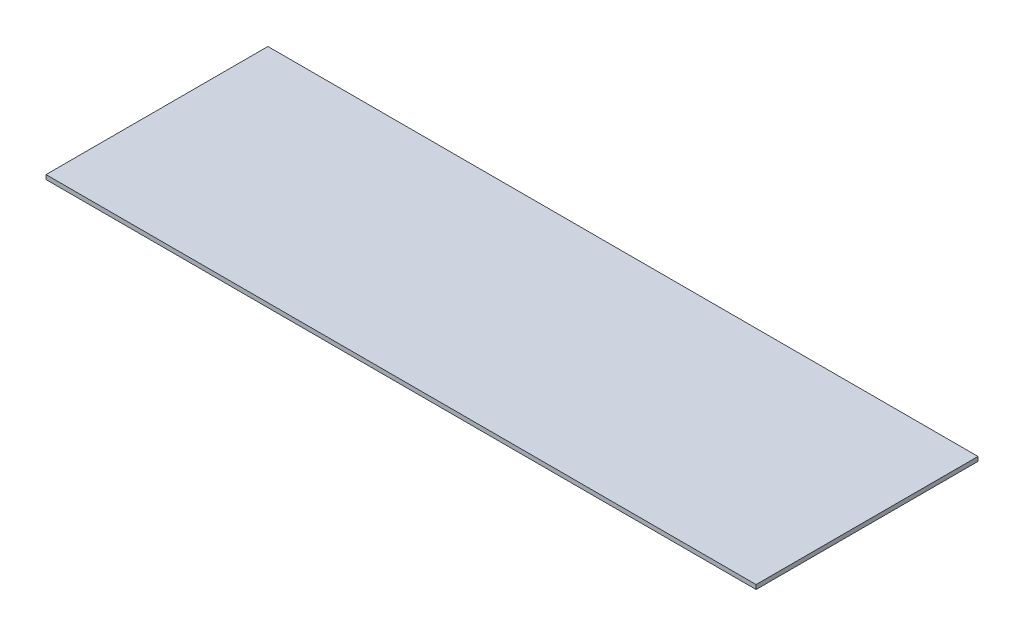
ISO-10303-21;
HEADER;
FILE_DESCRIPTION(('STEP AP214'),'2;1');
FILE_NAME('part.step','',(''),(''),'','','');
FILE_SCHEMA(('AUTOMOTIVE_DESIGN { 1 0 10303 214 1 1 1 1 }'));
ENDSEC;
DATA;
#1=APPLICATION_CONTEXT('core data for automotive mechanical design processes');
#2=APPLICATION_PROTOCOL_DEFINITION('international standard','automotive_design',2000,#1);
#3=PRODUCT_CONTEXT('',#1,'mechanical');
#4=PRODUCT('Part','Part','',(#3));
#5=PRODUCT_RELATED_PRODUCT_CATEGORY('part','',(#4));
#6=PRODUCT_DEFINITION_FORMATION('','',#4);
#7=PRODUCT_DEFINITION_CONTEXT('part definition',#1,'design');
#8=PRODUCT_DEFINITION('design','',#6,#7);
#9=PRODUCT_DEFINITION_SHAPE('','',#8);
#10=(LENGTH_UNIT() NAMED_UNIT(*) SI_UNIT(.MILLI.,.METRE.));
#11=(NAMED_UNIT(*) PLANE_ANGLE_UNIT() SI_UNIT($,.RADIAN.));
#12=(NAMED_UNIT(*) SI_UNIT($,.STERADIAN.) SOLID_ANGLE_UNIT());
#13=UNCERTAINTY_MEASURE_WITH_UNIT(LENGTH_MEASURE(1.E-05),#10,'distance_accuracy_value','');
#14=(GEOMETRIC_REPRESENTATION_CONTEXT(3) GLOBAL_UNCERTAINTY_ASSIGNED_CONTEXT((#13)) GLOBAL_UNIT_ASSIGNED_CONTEXT((#10,
#11,#12)) REPRESENTATION_CONTEXT('',''));
#15=CARTESIAN_POINT('',(0.,0.,0.));
#16=DIRECTION('',(0.,0.,1.));
#17=DIRECTION('',(1.,0.,0.));
#18=AXIS2_PLACEMENT_3D('',#15,#16,#17);
#19=CARTESIAN_POINT('',(522.224,6.35,-163.195));
#20=DIRECTION('',(-1.,0.,0.));
#21=DIRECTION('',(0.,0.,1.));
#22=AXIS2_PLACEMENT_3D('',#19,#20,#21);
#23=PLANE('',#22);
#24=DIRECTION('',(0.,0.,-1.));
#25=VECTOR('',#24,1.);
#26=CARTESIAN_POINT('',(522.224,0.,-163.195));
#27=LINE('',#26,#25);
#28=CARTESIAN_POINT('',(522.224,0.,163.195));
#29=VERTEX_POINT('',#28);
#30=CARTESIAN_POINT('',(522.224,0.,-163.195));
#31=VERTEX_POINT('',#30);
#32=EDGE_CURVE('E96',#29,#31,#27,.T.);
#33=ORIENTED_EDGE('',*,*,#32,.T.);
#34=DIRECTION('',(0.,-1.,0.));
#35=VECTOR('',#34,1.);
#36=CARTESIAN_POINT('',(522.224,6.35,-163.195));
#37=LINE('',#36,#35);
#38=CARTESIAN_POINT('',(522.224,6.35,-163.195));
#39=VERTEX_POINT('',#38);
#40=EDGE_CURVE('E11',#39,#31,#37,.T.);
#41=ORIENTED_EDGE('',*,*,#40,.F.);
#42=DIRECTION('',(0.,0.,-1.));
#43=VECTOR('',#42,1.);
#44=CARTESIAN_POINT('',(522.224,6.35,-163.195));
#45=LINE('',#44,#43);
#46=CARTESIAN_POINT('',(522.224,6.35,163.195));
#47=VERTEX_POINT('',#46);
#48=EDGE_CURVE('E84',#47,#39,#45,.T.);
#49=ORIENTED_EDGE('',*,*,#48,.F.);
#50=DIRECTION('',(0.,-1.,0.));
#51=VECTOR('',#50,1.);
#52=CARTESIAN_POINT('',(522.224,6.35,163.195));
#53=LINE('',#52,#51);
#54=EDGE_CURVE('E92',#47,#29,#53,.T.);
#55=ORIENTED_EDGE('',*,*,#54,.T.);
#56=EDGE_LOOP('',(#33,#41,#49,#55));
#57=FACE_BOUND('',#56,.T.);
#58=ADVANCED_FACE('F33',(#57),#23,.F.);
#59=CARTESIAN_POINT('',(-522.224,6.35,-163.195));
#60=DIRECTION('',(0.,0.,1.));
#61=DIRECTION('',(1.,0.,0.));
#62=AXIS2_PLACEMENT_3D('',#59,#60,#61);
#63=PLANE('',#62);
#64=DIRECTION('',(-1.,0.,0.));
#65=VECTOR('',#64,1.);
#66=CARTESIAN_POINT('',(-522.224,0.,-163.195));
#67=LINE('',#66,#65);
#68=CARTESIAN_POINT('',(-522.224,0.,-163.195));
#69=VERTEX_POINT('',#68);
#70=EDGE_CURVE('E88',#31,#69,#67,.T.);
#71=ORIENTED_EDGE('',*,*,#70,.T.);
#72=DIRECTION('',(0.,-1.,0.));
#73=VECTOR('',#72,1.);
#74=CARTESIAN_POINT('',(-522.224,6.35,-163.195));
#75=LINE('',#74,#73);
#76=CARTESIAN_POINT('',(-522.224,6.35,-163.195));
#77=VERTEX_POINT('',#76);
#78=EDGE_CURVE('E41',#77,#69,#75,.T.);
#79=ORIENTED_EDGE('',*,*,#78,.F.);
#80=DIRECTION('',(-1.,0.,0.));
#81=VECTOR('',#80,1.);
#82=CARTESIAN_POINT('',(-522.224,6.35,-163.195));
#83=LINE('',#82,#81);
#84=EDGE_CURVE('E79',#39,#77,#83,.T.);
#85=ORIENTED_EDGE('',*,*,#84,.F.);
#86=ORIENTED_EDGE('',*,*,#40,.T.);
#87=EDGE_LOOP('',(#71,#79,#85,#86));
#88=FACE_BOUND('',#87,.T.);
#89=ADVANCED_FACE('F87',(#88),#63,.F.);
#90=CARTESIAN_POINT('',(-522.224,6.35,-163.195));
#91=DIRECTION('',(1.,0.,0.));
#92=DIRECTION('',(0.,0.,-1.));
#93=AXIS2_PLACEMENT_3D('',#90,#91,#92);
#94=PLANE('',#93);
#95=DIRECTION('',(0.,0.,1.));
#96=VECTOR('',#95,1.);
#97=CARTESIAN_POINT('',(-522.224,0.,-163.195));
#98=LINE('',#97,#96);
#99=CARTESIAN_POINT('',(-522.224,0.,163.195));
#100=VERTEX_POINT('',#99);
#101=EDGE_CURVE('E66',#69,#100,#98,.T.);
#102=ORIENTED_EDGE('',*,*,#101,.T.);
#103=DIRECTION('',(0.,-1.,0.));
#104=VECTOR('',#103,1.);
#105=CARTESIAN_POINT('',(-522.224,6.35,163.195));
#106=LINE('',#105,#104);
#107=CARTESIAN_POINT('',(-522.224,6.35,163.195));
#108=VERTEX_POINT('',#107);
#109=EDGE_CURVE('E89',#108,#100,#106,.T.);
#110=ORIENTED_EDGE('',*,*,#109,.F.);
#111=DIRECTION('',(0.,0.,1.));
#112=VECTOR('',#111,1.);
#113=CARTESIAN_POINT('',(-522.224,6.35,-163.195));
#114=LINE('',#113,#112);
#115=EDGE_CURVE('E82',#77,#108,#114,.T.);
#116=ORIENTED_EDGE('',*,*,#115,.F.);
#117=ORIENTED_EDGE('',*,*,#78,.T.);
#118=EDGE_LOOP('',(#102,#110,#116,#117));
#119=FACE_BOUND('',#118,.T.);
#120=ADVANCED_FACE('F90',(#119),#94,.F.);
#121=CARTESIAN_POINT('',(-522.224,6.35,163.195));
#122=DIRECTION('',(0.,0.,-1.));
#123=DIRECTION('',(-1.,0.,0.));
#124=AXIS2_PLACEMENT_3D('',#121,#122,#123);
#125=PLANE('',#124);
#126=DIRECTION('',(1.,0.,0.));
#127=VECTOR('',#126,1.);
#128=CARTESIAN_POINT('',(-522.224,0.,163.195));
#129=LINE('',#128,#127);
#130=EDGE_CURVE('E72',#100,#29,#129,.T.);
#131=ORIENTED_EDGE('',*,*,#130,.T.);
#132=ORIENTED_EDGE('',*,*,#54,.F.);
#133=DIRECTION('',(1.,0.,0.));
#134=VECTOR('',#133,1.);
#135=CARTESIAN_POINT('',(-522.224,6.35,163.195));
#136=LINE('',#135,#134);
#137=EDGE_CURVE('E49',#108,#47,#136,.T.);
#138=ORIENTED_EDGE('',*,*,#137,.F.);
#139=ORIENTED_EDGE('',*,*,#109,.T.);
#140=EDGE_LOOP('',(#131,#132,#138,#139));
#141=FACE_BOUND('',#140,.T.);
#142=ADVANCED_FACE('F103',(#141),#125,.F.);
#143=CARTESIAN_POINT('',(0.,6.35,0.));
#144=DIRECTION('',(0.,1.,0.));
#145=DIRECTION('',(0.,0.,1.));
#146=AXIS2_PLACEMENT_3D('',#143,#144,#145);
#147=PLANE('',#146);
#148=ORIENTED_EDGE('',*,*,#48,.T.);
#149=ORIENTED_EDGE('',*,*,#84,.T.);
#150=ORIENTED_EDGE('',*,*,#115,.T.);
#151=ORIENTED_EDGE('',*,*,#137,.T.);
#152=EDGE_LOOP('',(#148,#149,#150,#151));
#153=FACE_BOUND('',#152,.T.);
#154=ADVANCED_FACE('F80',(#153),#147,.T.);
#155=CARTESIAN_POINT('',(0.,0.,0.));
#156=DIRECTION('',(0.,1.,0.));
#157=DIRECTION('',(0.,0.,1.));
#158=AXIS2_PLACEMENT_3D('',#155,#156,#157);
#159=PLANE('',#158);
#160=ORIENTED_EDGE('',*,*,#32,.F.);
#161=ORIENTED_EDGE('',*,*,#130,.F.);
#162=ORIENTED_EDGE('',*,*,#101,.F.);
#163=ORIENTED_EDGE('',*,*,#70,.F.);
#164=EDGE_LOOP('',(#160,#161,#162,#163));
#165=FACE_BOUND('',#164,.T.);
#166=ADVANCED_FACE('F106',(#165),#159,.F.);
#167=CLOSED_SHELL('',(#58,#89,#120,#142,#154,#166));
#168=MANIFOLD_SOLID_BREP('B2',#167);
#169=ADVANCED_BREP_SHAPE_REPRESENTATION('',(#18,#168),#14);
#170=SHAPE_DEFINITION_REPRESENTATION(#9,#169);
ENDSEC;
END-ISO-10303-21;
